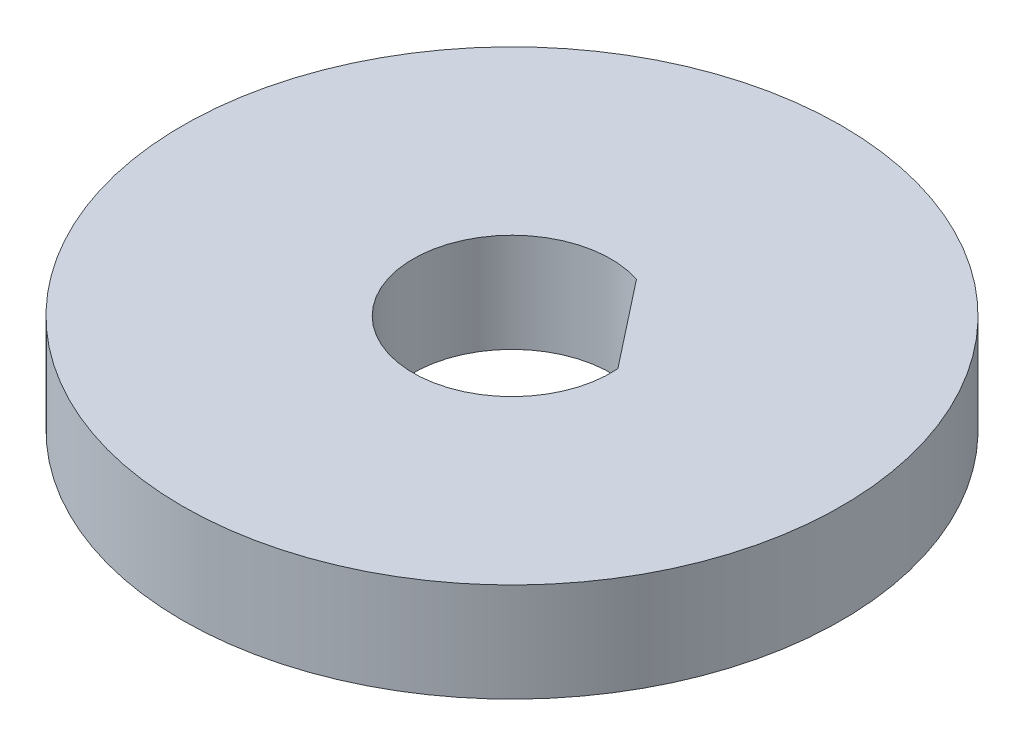
ISO-10303-21;
HEADER;
FILE_DESCRIPTION(('STEP AP214'),'2;1');
FILE_NAME('part.step','',(''),(''),'','','');
FILE_SCHEMA(('AUTOMOTIVE_DESIGN { 1 0 10303 214 1 1 1 1 }'));
ENDSEC;
DATA;
#1=APPLICATION_CONTEXT('core data for automotive mechanical design processes');
#2=APPLICATION_PROTOCOL_DEFINITION('international standard','automotive_design',2000,#1);
#3=PRODUCT_CONTEXT('',#1,'mechanical');
#4=PRODUCT('Part','Part','',(#3));
#5=PRODUCT_RELATED_PRODUCT_CATEGORY('part','',(#4));
#6=PRODUCT_DEFINITION_FORMATION('','',#4);
#7=PRODUCT_DEFINITION_CONTEXT('part definition',#1,'design');
#8=PRODUCT_DEFINITION('design','',#6,#7);
#9=PRODUCT_DEFINITION_SHAPE('','',#8);
#10=(LENGTH_UNIT() NAMED_UNIT(*) SI_UNIT(.MILLI.,.METRE.));
#11=(NAMED_UNIT(*) PLANE_ANGLE_UNIT() SI_UNIT($,.RADIAN.));
#12=(NAMED_UNIT(*) SI_UNIT($,.STERADIAN.) SOLID_ANGLE_UNIT());
#13=UNCERTAINTY_MEASURE_WITH_UNIT(LENGTH_MEASURE(1.E-05),#10,'distance_accuracy_value','');
#14=(GEOMETRIC_REPRESENTATION_CONTEXT(3) GLOBAL_UNCERTAINTY_ASSIGNED_CONTEXT((#13)) GLOBAL_UNIT_ASSIGNED_CONTEXT((#10,
#11,#12)) REPRESENTATION_CONTEXT('',''));
#15=CARTESIAN_POINT('',(0.,0.,0.));
#16=DIRECTION('',(0.,0.,1.));
#17=DIRECTION('',(1.,0.,0.));
#18=AXIS2_PLACEMENT_3D('',#15,#16,#17);
#19=CARTESIAN_POINT('',(0.,3.,0.));
#20=DIRECTION('',(0.,1.,0.));
#21=DIRECTION('',(0.,0.,1.));
#22=AXIS2_PLACEMENT_3D('',#19,#20,#21);
#23=PLANE('',#22);
#24=CARTESIAN_POINT('',(0.,3.,0.));
#25=DIRECTION('',(0.,1.,0.));
#26=DIRECTION('',(0.,0.,1.));
#27=AXIS2_PLACEMENT_3D('',#24,#25,#26);
#28=CIRCLE('',#27,10.);
#29=CARTESIAN_POINT('',(0.,3.,10.));
#30=VERTEX_POINT('',#29);
#31=EDGE_CURVE('E11',#30,#30,#28,.T.);
#32=ORIENTED_EDGE('',*,*,#31,.T.);
#33=EDGE_LOOP('',(#32));
#34=FACE_BOUND('',#33,.T.);
#35=CARTESIAN_POINT('',(0.,3.,0.));
#36=DIRECTION('',(0.,1.,0.));
#37=DIRECTION('',(0.,0.,1.));
#38=AXIS2_PLACEMENT_3D('',#35,#36,#37);
#39=CIRCLE('',#38,3.);
#40=CARTESIAN_POINT('',(0.92261437068596,3.,-2.85460727999558));
#41=VERTEX_POINT('',#40);
#42=CARTESIAN_POINT('',(2.99191333353129,3.,-0.22012406646636));
#43=VERTEX_POINT('',#42);
#44=EDGE_CURVE('E69',#41,#43,#39,.T.);
#45=ORIENTED_EDGE('',*,*,#44,.F.);
#46=DIRECTION('',(0.617701182938905,0.,0.786412899560961));
#47=VECTOR('',#46,1.);
#48=CARTESIAN_POINT('',(1.95726385210862,3.,-1.53736567323097));
#49=LINE('',#48,#47);
#50=EDGE_CURVE('E50',#41,#43,#49,.T.);
#51=ORIENTED_EDGE('',*,*,#50,.T.);
#52=EDGE_LOOP('',(#45,#51));
#53=FACE_BOUND('',#52,.T.);
#54=ADVANCED_FACE('F35',(#34,#53),#23,.T.);
#55=CARTESIAN_POINT('',(0.,0.,0.));
#56=DIRECTION('',(0.,1.,0.));
#57=DIRECTION('',(0.,0.,1.));
#58=AXIS2_PLACEMENT_3D('',#55,#56,#57);
#59=PLANE('',#58);
#60=CARTESIAN_POINT('',(0.,0.,0.));
#61=DIRECTION('',(0.,1.,0.));
#62=DIRECTION('',(0.,0.,1.));
#63=AXIS2_PLACEMENT_3D('',#60,#61,#62);
#64=CIRCLE('',#63,10.);
#65=CARTESIAN_POINT('',(0.,0.,10.));
#66=VERTEX_POINT('',#65);
#67=EDGE_CURVE('E39',#66,#66,#64,.T.);
#68=ORIENTED_EDGE('',*,*,#67,.F.);
#69=EDGE_LOOP('',(#68));
#70=FACE_BOUND('',#69,.T.);
#71=DIRECTION('',(0.617701182938905,0.,0.786412899560961));
#72=VECTOR('',#71,1.);
#73=CARTESIAN_POINT('',(1.95726385210862,0.,-1.53736567323097));
#74=LINE('',#73,#72);
#75=CARTESIAN_POINT('',(0.922614370685959,0.,-2.85460727999558));
#76=VERTEX_POINT('',#75);
#77=CARTESIAN_POINT('',(2.99191333353129,0.,-0.22012406646636));
#78=VERTEX_POINT('',#77);
#79=EDGE_CURVE('E64',#76,#78,#74,.T.);
#80=ORIENTED_EDGE('',*,*,#79,.F.);
#81=CARTESIAN_POINT('',(0.,0.,0.));
#82=DIRECTION('',(0.,1.,0.));
#83=DIRECTION('',(0.,0.,1.));
#84=AXIS2_PLACEMENT_3D('',#81,#82,#83);
#85=CIRCLE('',#84,3.);
#86=EDGE_CURVE('E75',#76,#78,#85,.T.);
#87=ORIENTED_EDGE('',*,*,#86,.T.);
#88=EDGE_LOOP('',(#80,#87));
#89=FACE_BOUND('',#88,.T.);
#90=ADVANCED_FACE('F79',(#70,#89),#59,.F.);
#91=CARTESIAN_POINT('',(0.,3.,0.));
#92=DIRECTION('',(0.,-1.,0.));
#93=DIRECTION('',(0.,0.,-1.));
#94=AXIS2_PLACEMENT_3D('',#91,#92,#93);
#95=CYLINDRICAL_SURFACE('',#94,10.);
#96=ORIENTED_EDGE('',*,*,#31,.F.);
#97=EDGE_LOOP('',(#96));
#98=FACE_BOUND('',#97,.T.);
#99=ORIENTED_EDGE('',*,*,#67,.T.);
#100=EDGE_LOOP('',(#99));
#101=FACE_BOUND('',#100,.T.);
#102=ADVANCED_FACE('F37',(#98,#101),#95,.T.);
#103=CARTESIAN_POINT('',(1.95726385210862,0.,-1.53736567323097));
#104=DIRECTION('',(-0.78641289956096,0.,0.617701182938905));
#105=DIRECTION('',(0.617701182938905,0.,0.786412899560961));
#106=AXIS2_PLACEMENT_3D('',#103,#104,#105);
#107=PLANE('',#106);
#108=ORIENTED_EDGE('',*,*,#50,.F.);
#109=DIRECTION('',(0.,1.,0.));
#110=VECTOR('',#109,1.);
#111=CARTESIAN_POINT('',(0.922614370685959,0.,-2.85460727999558));
#112=LINE('',#111,#110);
#113=EDGE_CURVE('E66',#76,#41,#112,.T.);
#114=ORIENTED_EDGE('',*,*,#113,.F.);
#115=ORIENTED_EDGE('',*,*,#79,.T.);
#116=DIRECTION('',(0.,1.,0.));
#117=VECTOR('',#116,1.);
#118=CARTESIAN_POINT('',(2.99191333353129,0.,-0.22012406646636));
#119=LINE('',#118,#117);
#120=EDGE_CURVE('E57',#78,#43,#119,.T.);
#121=ORIENTED_EDGE('',*,*,#120,.T.);
#122=EDGE_LOOP('',(#108,#114,#115,#121));
#123=FACE_BOUND('',#122,.T.);
#124=ADVANCED_FACE('F62',(#123),#107,.T.);
#125=CARTESIAN_POINT('',(0.,0.,0.));
#126=DIRECTION('',(0.,1.,0.));
#127=DIRECTION('',(0.,0.,1.));
#128=AXIS2_PLACEMENT_3D('',#125,#126,#127);
#129=CYLINDRICAL_SURFACE('',#128,3.);
#130=ORIENTED_EDGE('',*,*,#44,.T.);
#131=ORIENTED_EDGE('',*,*,#120,.F.);
#132=ORIENTED_EDGE('',*,*,#86,.F.);
#133=ORIENTED_EDGE('',*,*,#113,.T.);
#134=EDGE_LOOP('',(#130,#131,#132,#133));
#135=FACE_BOUND('',#134,.T.);
#136=ADVANCED_FACE('F70',(#135),#129,.F.);
#137=CLOSED_SHELL('',(#54,#90,#102,#124,#136));
#138=MANIFOLD_SOLID_BREP('B2',#137);
#139=ADVANCED_BREP_SHAPE_REPRESENTATION('',(#18,#138),#14);
#140=SHAPE_DEFINITION_REPRESENTATION(#9,#139);
ENDSEC;
END-ISO-10303-21;
